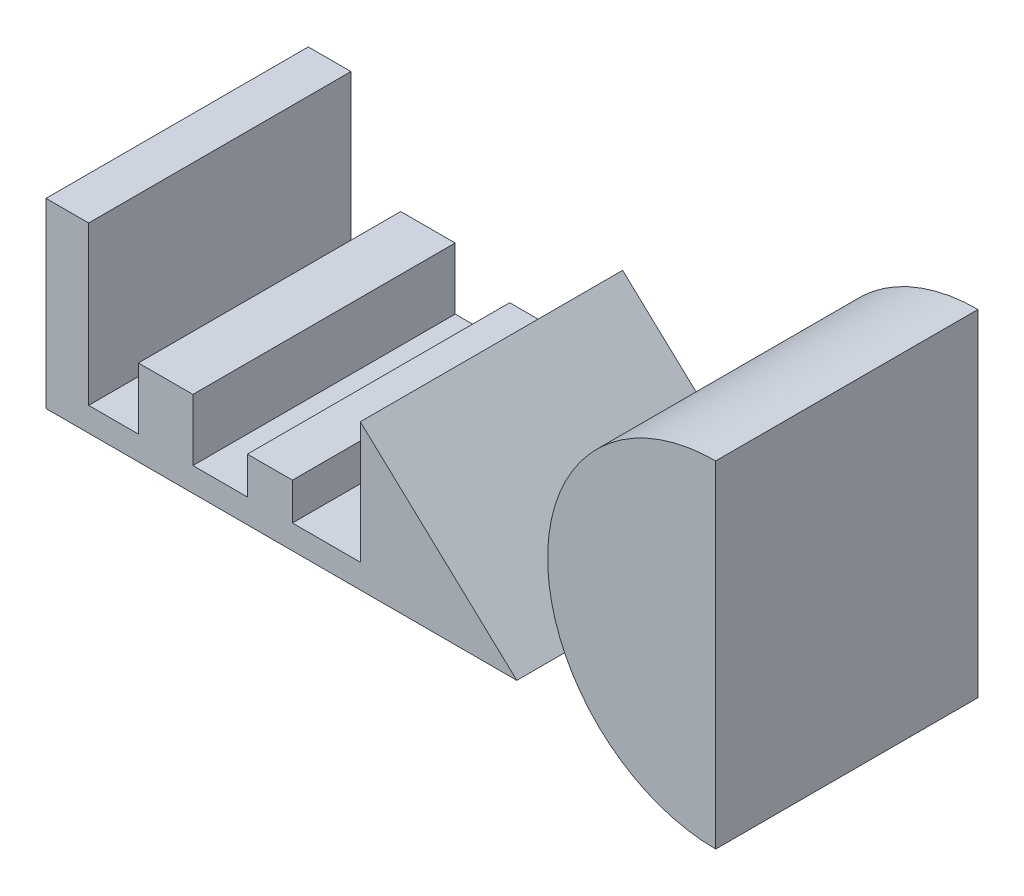
ISO-10303-21;
HEADER;
FILE_DESCRIPTION(('STEP AP214'),'2;1');
FILE_NAME('part.step','',(''),(''),'','','');
FILE_SCHEMA(('AUTOMOTIVE_DESIGN { 1 0 10303 214 1 1 1 1 }'));
ENDSEC;
DATA;
#1=APPLICATION_CONTEXT('core data for automotive mechanical design processes');
#2=APPLICATION_PROTOCOL_DEFINITION('international standard','automotive_design',2000,#1);
#3=PRODUCT_CONTEXT('',#1,'mechanical');
#4=PRODUCT('Part','Part','',(#3));
#5=PRODUCT_RELATED_PRODUCT_CATEGORY('part','',(#4));
#6=PRODUCT_DEFINITION_FORMATION('','',#4);
#7=PRODUCT_DEFINITION_CONTEXT('part definition',#1,'design');
#8=PRODUCT_DEFINITION('design','',#6,#7);
#9=PRODUCT_DEFINITION_SHAPE('','',#8);
#10=(LENGTH_UNIT() NAMED_UNIT(*) SI_UNIT(.MILLI.,.METRE.));
#11=(NAMED_UNIT(*) PLANE_ANGLE_UNIT() SI_UNIT($,.RADIAN.));
#12=(NAMED_UNIT(*) SI_UNIT($,.STERADIAN.) SOLID_ANGLE_UNIT());
#13=UNCERTAINTY_MEASURE_WITH_UNIT(LENGTH_MEASURE(1.E-05),#10,'distance_accuracy_value','');
#14=(GEOMETRIC_REPRESENTATION_CONTEXT(3) GLOBAL_UNCERTAINTY_ASSIGNED_CONTEXT((#13)) GLOBAL_UNIT_ASSIGNED_CONTEXT((#10,
#11,#12)) REPRESENTATION_CONTEXT('',''));
#15=CARTESIAN_POINT('',(0.,0.,0.));
#16=DIRECTION('',(0.,0.,1.));
#17=DIRECTION('',(1.,0.,0.));
#18=AXIS2_PLACEMENT_3D('',#15,#16,#17);
#19=CARTESIAN_POINT('',(972.879836168344,176.420111136161,190.5));
#20=DIRECTION('',(0.,0.,-1.));
#21=DIRECTION('',(-1.,0.,0.));
#22=AXIS2_PLACEMENT_3D('',#19,#20,#21);
#23=CYLINDRICAL_SURFACE('',#22,244.183019467738);
#24=CARTESIAN_POINT('',(972.879836168344,176.420111136161,-190.5));
#25=DIRECTION('',(0.,0.,1.));
#26=DIRECTION('',(1.,0.,0.));
#27=AXIS2_PLACEMENT_3D('',#24,#25,#26);
#28=CIRCLE('',#27,244.183019467738);
#29=CARTESIAN_POINT('',(972.879836168344,420.603130603899,-190.5));
#30=VERTEX_POINT('',#29);
#31=CARTESIAN_POINT('',(972.879836168344,-67.7629083315776,-190.5));
#32=VERTEX_POINT('',#31);
#33=EDGE_CURVE('E77',#30,#32,#28,.T.);
#34=ORIENTED_EDGE('',*,*,#33,.T.);
#35=DIRECTION('',(0.,0.,-1.));
#36=VECTOR('',#35,1.);
#37=CARTESIAN_POINT('',(972.879836168344,-67.7629083315776,190.5));
#38=LINE('',#37,#36);
#39=CARTESIAN_POINT('',(972.879836168344,-67.7629083315776,190.5));
#40=VERTEX_POINT('',#39);
#41=EDGE_CURVE('E12',#40,#32,#38,.T.);
#42=ORIENTED_EDGE('',*,*,#41,.F.);
#43=CARTESIAN_POINT('',(972.879836168344,176.420111136161,190.5));
#44=DIRECTION('',(0.,0.,1.));
#45=DIRECTION('',(1.,0.,0.));
#46=AXIS2_PLACEMENT_3D('',#43,#44,#45);
#47=CIRCLE('',#46,244.183019467738);
#48=CARTESIAN_POINT('',(972.879836168344,420.603130603899,190.5));
#49=VERTEX_POINT('',#48);
#50=EDGE_CURVE('E76',#49,#40,#47,.T.);
#51=ORIENTED_EDGE('',*,*,#50,.F.);
#52=DIRECTION('',(0.,0.,-1.));
#53=VECTOR('',#52,1.);
#54=CARTESIAN_POINT('',(972.879836168344,420.603130603899,190.5));
#55=LINE('',#54,#53);
#56=EDGE_CURVE('E54',#49,#30,#55,.T.);
#57=ORIENTED_EDGE('',*,*,#56,.T.);
#58=EDGE_LOOP('',(#34,#42,#51,#57));
#59=FACE_BOUND('',#58,.T.);
#60=ADVANCED_FACE('F46',(#59),#23,.T.);
#61=CARTESIAN_POINT('',(972.879836168344,420.603130603899,190.5));
#62=DIRECTION('',(-1.,0.,0.));
#63=DIRECTION('',(0.,0.,1.));
#64=AXIS2_PLACEMENT_3D('',#61,#62,#63);
#65=PLANE('',#64);
#66=DIRECTION('',(0.,1.,0.));
#67=VECTOR('',#66,1.);
#68=CARTESIAN_POINT('',(972.879836168344,420.603130603899,-190.5));
#69=LINE('',#68,#67);
#70=EDGE_CURVE('E69',#32,#30,#69,.T.);
#71=ORIENTED_EDGE('',*,*,#70,.T.);
#72=ORIENTED_EDGE('',*,*,#56,.F.);
#73=DIRECTION('',(0.,1.,0.));
#74=VECTOR('',#73,1.);
#75=CARTESIAN_POINT('',(972.879836168344,420.603130603899,190.5));
#76=LINE('',#75,#74);
#77=EDGE_CURVE('E61',#40,#49,#76,.T.);
#78=ORIENTED_EDGE('',*,*,#77,.F.);
#79=ORIENTED_EDGE('',*,*,#41,.T.);
#80=EDGE_LOOP('',(#71,#72,#78,#79));
#81=FACE_BOUND('',#80,.T.);
#82=ADVANCED_FACE('F72',(#81),#65,.F.);
#83=CARTESIAN_POINT('',(972.879836168344,176.420111136161,190.5));
#84=DIRECTION('',(0.,0.,1.));
#85=DIRECTION('',(1.,0.,0.));
#86=AXIS2_PLACEMENT_3D('',#83,#84,#85);
#87=PLANE('',#86);
#88=ORIENTED_EDGE('',*,*,#50,.T.);
#89=ORIENTED_EDGE('',*,*,#77,.T.);
#90=EDGE_LOOP('',(#88,#89));
#91=FACE_BOUND('',#90,.T.);
#92=ADVANCED_FACE('F84',(#91),#87,.T.);
#93=CARTESIAN_POINT('',(972.879836168344,176.420111136161,-190.5));
#94=DIRECTION('',(0.,0.,1.));
#95=DIRECTION('',(1.,0.,0.));
#96=AXIS2_PLACEMENT_3D('',#93,#94,#95);
#97=PLANE('',#96);
#98=ORIENTED_EDGE('',*,*,#33,.F.);
#99=ORIENTED_EDGE('',*,*,#70,.F.);
#100=EDGE_LOOP('',(#98,#99));
#101=FACE_BOUND('',#100,.T.);
#102=ADVANCED_FACE('F80',(#101),#97,.F.);
#103=CLOSED_SHELL('',(#60,#82,#92,#102));
#104=MANIFOLD_SOLID_BREP('B2',#103);
#105=CARTESIAN_POINT('',(683.937189207744,0.,190.5));
#106=DIRECTION('',(0.,1.,0.));
#107=DIRECTION('',(0.,0.,1.));
#108=AXIS2_PLACEMENT_3D('',#105,#106,#107);
#109=PLANE('',#108);
#110=DIRECTION('',(1.,0.,0.));
#111=VECTOR('',#110,1.);
#112=CARTESIAN_POINT('',(683.937189207744,0.,-190.5));
#113=LINE('',#112,#111);
#114=CARTESIAN_POINT('',(0.,0.,-190.5));
#115=VERTEX_POINT('',#114);
#116=CARTESIAN_POINT('',(683.937189207744,0.,-190.5));
#117=VERTEX_POINT('',#116);
#118=EDGE_CURVE('E255',#115,#117,#113,.T.);
#119=ORIENTED_EDGE('',*,*,#118,.T.);
#120=DIRECTION('',(0.,0.,-1.));
#121=VECTOR('',#120,1.);
#122=CARTESIAN_POINT('',(683.937189207744,0.,190.5));
#123=LINE('',#122,#121);
#124=CARTESIAN_POINT('',(683.937189207744,0.,190.5));
#125=VERTEX_POINT('',#124);
#126=EDGE_CURVE('E44',#125,#117,#123,.T.);
#127=ORIENTED_EDGE('',*,*,#126,.F.);
#128=DIRECTION('',(1.,0.,0.));
#129=VECTOR('',#128,1.);
#130=CARTESIAN_POINT('',(683.937189207744,0.,190.5));
#131=LINE('',#130,#129);
#132=CARTESIAN_POINT('',(0.,0.,190.5));
#133=VERTEX_POINT('',#132);
#134=EDGE_CURVE('E283',#133,#125,#131,.T.);
#135=ORIENTED_EDGE('',*,*,#134,.F.);
#136=DIRECTION('',(0.,0.,-1.));
#137=VECTOR('',#136,1.);
#138=CARTESIAN_POINT('',(0.,0.,190.5));
#139=LINE('',#138,#137);
#140=EDGE_CURVE('E251',#133,#115,#139,.T.);
#141=ORIENTED_EDGE('',*,*,#140,.T.);
#142=EDGE_LOOP('',(#119,#127,#135,#141));
#143=FACE_BOUND('',#142,.T.);
#144=ADVANCED_FACE('F117',(#143),#109,.F.);
#145=CARTESIAN_POINT('',(456.600579214778,211.665343882228,190.5));
#146=DIRECTION('',(-0.681430807762917,-0.731882541280756,0.));
#147=DIRECTION('',(0.731882541280756,-0.681430807762917,0.));
#148=AXIS2_PLACEMENT_3D('',#145,#146,#147);
#149=PLANE('',#148);
#150=DIRECTION('',(-0.731882541280756,0.681430807762917,0.));
#151=VECTOR('',#150,1.);
#152=CARTESIAN_POINT('',(456.600579214778,211.665343882228,-190.5));
#153=LINE('',#152,#151);
#154=CARTESIAN_POINT('',(456.600579214778,211.665343882228,-190.5));
#155=VERTEX_POINT('',#154);
#156=EDGE_CURVE('E258',#117,#155,#153,.T.);
#157=ORIENTED_EDGE('',*,*,#156,.T.);
#158=DIRECTION('',(0.,0.,-1.));
#159=VECTOR('',#158,1.);
#160=CARTESIAN_POINT('',(456.600579214778,211.665343882228,190.5));
#161=LINE('',#160,#159);
#162=CARTESIAN_POINT('',(456.600579214778,211.665343882228,190.5));
#163=VERTEX_POINT('',#162);
#164=EDGE_CURVE('E125',#163,#155,#161,.T.);
#165=ORIENTED_EDGE('',*,*,#164,.F.);
#166=DIRECTION('',(-0.731882541280756,0.681430807762917,0.));
#167=VECTOR('',#166,1.);
#168=CARTESIAN_POINT('',(456.600579214778,211.665343882228,190.5));
#169=LINE('',#168,#167);
#170=EDGE_CURVE('E197',#125,#163,#169,.T.);
#171=ORIENTED_EDGE('',*,*,#170,.F.);
#172=ORIENTED_EDGE('',*,*,#126,.T.);
#173=EDGE_LOOP('',(#157,#165,#171,#172));
#174=FACE_BOUND('',#173,.T.);
#175=ADVANCED_FACE('F376',(#174),#149,.F.);
#176=CARTESIAN_POINT('',(456.600579214778,34.9907479046501,190.5));
#177=DIRECTION('',(1.,0.,0.));
#178=DIRECTION('',(0.,0.,-1.));
#179=AXIS2_PLACEMENT_3D('',#176,#177,#178);
#180=PLANE('',#179);
#181=DIRECTION('',(0.,-1.,0.));
#182=VECTOR('',#181,1.);
#183=CARTESIAN_POINT('',(456.600579214778,34.9907479046501,-190.5));
#184=LINE('',#183,#182);
#185=CARTESIAN_POINT('',(456.600579214778,34.9907479046501,-190.5));
#186=VERTEX_POINT('',#185);
#187=EDGE_CURVE('E260',#155,#186,#184,.T.);
#188=ORIENTED_EDGE('',*,*,#187,.T.);
#189=DIRECTION('',(0.,0.,-1.));
#190=VECTOR('',#189,1.);
#191=CARTESIAN_POINT('',(456.600579214778,34.9907479046501,190.5));
#192=LINE('',#191,#190);
#193=CARTESIAN_POINT('',(456.600579214778,34.9907479046501,190.5));
#194=VERTEX_POINT('',#193);
#195=EDGE_CURVE('E311',#194,#186,#192,.T.);
#196=ORIENTED_EDGE('',*,*,#195,.F.);
#197=DIRECTION('',(0.,-1.,0.));
#198=VECTOR('',#197,1.);
#199=CARTESIAN_POINT('',(456.600579214778,34.9907479046501,190.5));
#200=LINE('',#199,#198);
#201=EDGE_CURVE('E319',#163,#194,#200,.T.);
#202=ORIENTED_EDGE('',*,*,#201,.F.);
#203=ORIENTED_EDGE('',*,*,#164,.T.);
#204=EDGE_LOOP('',(#188,#196,#202,#203));
#205=FACE_BOUND('',#204,.T.);
#206=ADVANCED_FACE('F317',(#205),#180,.F.);
#207=CARTESIAN_POINT('',(357.938142500027,34.9907479046501,190.5));
#208=DIRECTION('',(0.,-1.,0.));
#209=DIRECTION('',(0.,0.,-1.));
#210=AXIS2_PLACEMENT_3D('',#207,#208,#209);
#211=PLANE('',#210);
#212=DIRECTION('',(-1.,0.,0.));
#213=VECTOR('',#212,1.);
#214=CARTESIAN_POINT('',(357.938142500027,34.9907479046501,-190.5));
#215=LINE('',#214,#213);
#216=CARTESIAN_POINT('',(357.938142500027,34.9907479046501,-190.5));
#217=VERTEX_POINT('',#216);
#218=EDGE_CURVE('E262',#186,#217,#215,.T.);
#219=ORIENTED_EDGE('',*,*,#218,.T.);
#220=DIRECTION('',(0.,0.,-1.));
#221=VECTOR('',#220,1.);
#222=CARTESIAN_POINT('',(357.938142500027,34.9907479046501,190.5));
#223=LINE('',#222,#221);
#224=CARTESIAN_POINT('',(357.938142500027,34.9907479046501,190.5));
#225=VERTEX_POINT('',#224);
#226=EDGE_CURVE('E308',#225,#217,#223,.T.);
#227=ORIENTED_EDGE('',*,*,#226,.F.);
#228=DIRECTION('',(-1.,0.,0.));
#229=VECTOR('',#228,1.);
#230=CARTESIAN_POINT('',(357.938142500027,34.9907479046501,190.5));
#231=LINE('',#230,#229);
#232=EDGE_CURVE('E337',#194,#225,#231,.T.);
#233=ORIENTED_EDGE('',*,*,#232,.F.);
#234=ORIENTED_EDGE('',*,*,#195,.T.);
#235=EDGE_LOOP('',(#219,#227,#233,#234));
#236=FACE_BOUND('',#235,.T.);
#237=ADVANCED_FACE('F328',(#236),#211,.F.);
#238=CARTESIAN_POINT('',(357.938142500027,88.9109168068977,190.5));
#239=DIRECTION('',(-1.,0.,0.));
#240=DIRECTION('',(0.,0.,1.));
#241=AXIS2_PLACEMENT_3D('',#238,#239,#240);
#242=PLANE('',#241);
#243=DIRECTION('',(0.,1.,0.));
#244=VECTOR('',#243,1.);
#245=CARTESIAN_POINT('',(357.938142500027,88.9109168068977,-190.5));
#246=LINE('',#245,#244);
#247=CARTESIAN_POINT('',(357.938142500027,88.9109168068977,-190.5));
#248=VERTEX_POINT('',#247);
#249=EDGE_CURVE('E264',#217,#248,#246,.T.);
#250=ORIENTED_EDGE('',*,*,#249,.T.);
#251=DIRECTION('',(0.,0.,-1.));
#252=VECTOR('',#251,1.);
#253=CARTESIAN_POINT('',(357.938142500027,88.9109168068977,190.5));
#254=LINE('',#253,#252);
#255=CARTESIAN_POINT('',(357.938142500027,88.9109168068977,190.5));
#256=VERTEX_POINT('',#255);
#257=EDGE_CURVE('E305',#256,#248,#254,.T.);
#258=ORIENTED_EDGE('',*,*,#257,.F.);
#259=DIRECTION('',(0.,1.,0.));
#260=VECTOR('',#259,1.);
#261=CARTESIAN_POINT('',(357.938142500027,88.9109168068977,190.5));
#262=LINE('',#261,#260);
#263=EDGE_CURVE('E334',#225,#256,#262,.T.);
#264=ORIENTED_EDGE('',*,*,#263,.F.);
#265=ORIENTED_EDGE('',*,*,#226,.T.);
#266=EDGE_LOOP('',(#250,#258,#264,#265));
#267=FACE_BOUND('',#266,.T.);
#268=ADVANCED_FACE('F332',(#267),#242,.F.);
#269=CARTESIAN_POINT('',(292.545597235599,88.9109168068977,190.5));
#270=DIRECTION('',(0.,-1.,0.));
#271=DIRECTION('',(0.,0.,-1.));
#272=AXIS2_PLACEMENT_3D('',#269,#270,#271);
#273=PLANE('',#272);
#274=DIRECTION('',(-1.,0.,0.));
#275=VECTOR('',#274,1.);
#276=CARTESIAN_POINT('',(292.545597235599,88.9109168068977,-190.5));
#277=LINE('',#276,#275);
#278=CARTESIAN_POINT('',(292.545597235599,88.9109168068977,-190.5));
#279=VERTEX_POINT('',#278);
#280=EDGE_CURVE('E266',#248,#279,#277,.T.);
#281=ORIENTED_EDGE('',*,*,#280,.T.);
#282=DIRECTION('',(0.,0.,-1.));
#283=VECTOR('',#282,1.);
#284=CARTESIAN_POINT('',(292.545597235599,88.9109168068977,190.5));
#285=LINE('',#284,#283);
#286=CARTESIAN_POINT('',(292.545597235599,88.9109168068977,190.5));
#287=VERTEX_POINT('',#286);
#288=EDGE_CURVE('E302',#287,#279,#285,.T.);
#289=ORIENTED_EDGE('',*,*,#288,.F.);
#290=DIRECTION('',(-1.,0.,0.));
#291=VECTOR('',#290,1.);
#292=CARTESIAN_POINT('',(292.545597235599,88.9109168068977,190.5));
#293=LINE('',#292,#291);
#294=EDGE_CURVE('E336',#256,#287,#293,.T.);
#295=ORIENTED_EDGE('',*,*,#294,.F.);
#296=ORIENTED_EDGE('',*,*,#257,.T.);
#297=EDGE_LOOP('',(#281,#289,#295,#296));
#298=FACE_BOUND('',#297,.T.);
#299=ADVANCED_FACE('F389',(#298),#273,.F.);
#300=CARTESIAN_POINT('',(292.545597235599,34.9907479046501,190.5));
#301=DIRECTION('',(1.,0.,0.));
#302=DIRECTION('',(0.,0.,-1.));
#303=AXIS2_PLACEMENT_3D('',#300,#301,#302);
#304=PLANE('',#303);
#305=DIRECTION('',(0.,-1.,0.));
#306=VECTOR('',#305,1.);
#307=CARTESIAN_POINT('',(292.545597235599,34.9907479046501,-190.5));
#308=LINE('',#307,#306);
#309=CARTESIAN_POINT('',(292.545597235599,34.9907479046501,-190.5));
#310=VERTEX_POINT('',#309);
#311=EDGE_CURVE('E268',#279,#310,#308,.T.);
#312=ORIENTED_EDGE('',*,*,#311,.T.);
#313=DIRECTION('',(0.,0.,-1.));
#314=VECTOR('',#313,1.);
#315=CARTESIAN_POINT('',(292.545597235599,34.9907479046501,190.5));
#316=LINE('',#315,#314);
#317=CARTESIAN_POINT('',(292.545597235599,34.9907479046501,190.5));
#318=VERTEX_POINT('',#317);
#319=EDGE_CURVE('E299',#318,#310,#316,.T.);
#320=ORIENTED_EDGE('',*,*,#319,.F.);
#321=DIRECTION('',(0.,-1.,0.));
#322=VECTOR('',#321,1.);
#323=CARTESIAN_POINT('',(292.545597235599,34.9907479046501,190.5));
#324=LINE('',#323,#322);
#325=EDGE_CURVE('E339',#287,#318,#324,.T.);
#326=ORIENTED_EDGE('',*,*,#325,.F.);
#327=ORIENTED_EDGE('',*,*,#288,.T.);
#328=EDGE_LOOP('',(#312,#320,#326,#327));
#329=FACE_BOUND('',#328,.T.);
#330=ADVANCED_FACE('F392',(#329),#304,.F.);
#331=CARTESIAN_POINT('',(213.386200336555,34.9907479046501,190.5));
#332=DIRECTION('',(0.,-1.,0.));
#333=DIRECTION('',(0.,0.,-1.));
#334=AXIS2_PLACEMENT_3D('',#331,#332,#333);
#335=PLANE('',#334);
#336=DIRECTION('',(-1.,0.,0.));
#337=VECTOR('',#336,1.);
#338=CARTESIAN_POINT('',(213.386200336555,34.9907479046501,-190.5));
#339=LINE('',#338,#337);
#340=CARTESIAN_POINT('',(213.386200336555,34.9907479046501,-190.5));
#341=VERTEX_POINT('',#340);
#342=EDGE_CURVE('E270',#310,#341,#339,.T.);
#343=ORIENTED_EDGE('',*,*,#342,.T.);
#344=DIRECTION('',(0.,0.,-1.));
#345=VECTOR('',#344,1.);
#346=CARTESIAN_POINT('',(213.386200336555,34.9907479046501,190.5));
#347=LINE('',#346,#345);
#348=CARTESIAN_POINT('',(213.386200336555,34.9907479046501,190.5));
#349=VERTEX_POINT('',#348);
#350=EDGE_CURVE('E296',#349,#341,#347,.T.);
#351=ORIENTED_EDGE('',*,*,#350,.F.);
#352=DIRECTION('',(-1.,0.,0.));
#353=VECTOR('',#352,1.);
#354=CARTESIAN_POINT('',(213.386200336555,34.9907479046501,190.5));
#355=LINE('',#354,#353);
#356=EDGE_CURVE('E345',#318,#349,#355,.T.);
#357=ORIENTED_EDGE('',*,*,#356,.F.);
#358=ORIENTED_EDGE('',*,*,#319,.T.);
#359=EDGE_LOOP('',(#343,#351,#357,#358));
#360=FACE_BOUND('',#359,.T.);
#361=ADVANCED_FACE('F396',(#360),#335,.F.);
#362=CARTESIAN_POINT('',(213.386200336555,124.475283529657,190.5));
#363=DIRECTION('',(-1.,0.,0.));
#364=DIRECTION('',(0.,0.,1.));
#365=AXIS2_PLACEMENT_3D('',#362,#363,#364);
#366=PLANE('',#365);
#367=DIRECTION('',(0.,1.,0.));
#368=VECTOR('',#367,1.);
#369=CARTESIAN_POINT('',(213.386200336555,124.475283529657,-190.5));
#370=LINE('',#369,#368);
#371=CARTESIAN_POINT('',(213.386200336555,124.475283529657,-190.5));
#372=VERTEX_POINT('',#371);
#373=EDGE_CURVE('E272',#341,#372,#370,.T.);
#374=ORIENTED_EDGE('',*,*,#373,.T.);
#375=DIRECTION('',(0.,0.,-1.));
#376=VECTOR('',#375,1.);
#377=CARTESIAN_POINT('',(213.386200336555,124.475283529657,190.5));
#378=LINE('',#377,#376);
#379=CARTESIAN_POINT('',(213.386200336555,124.475283529657,190.5));
#380=VERTEX_POINT('',#379);
#381=EDGE_CURVE('E293',#380,#372,#378,.T.);
#382=ORIENTED_EDGE('',*,*,#381,.F.);
#383=DIRECTION('',(0.,1.,0.));
#384=VECTOR('',#383,1.);
#385=CARTESIAN_POINT('',(213.386200336555,124.475283529657,190.5));
#386=LINE('',#385,#384);
#387=EDGE_CURVE('E347',#349,#380,#386,.T.);
#388=ORIENTED_EDGE('',*,*,#387,.F.);
#389=ORIENTED_EDGE('',*,*,#350,.T.);
#390=EDGE_LOOP('',(#374,#382,#388,#389));
#391=FACE_BOUND('',#390,.T.);
#392=ADVANCED_FACE('F400',(#391),#366,.F.);
#393=CARTESIAN_POINT('',(134.22680343751,124.475283529657,190.5));
#394=DIRECTION('',(0.,-1.,0.));
#395=DIRECTION('',(0.,0.,-1.));
#396=AXIS2_PLACEMENT_3D('',#393,#394,#395);
#397=PLANE('',#396);
#398=DIRECTION('',(-1.,0.,0.));
#399=VECTOR('',#398,1.);
#400=CARTESIAN_POINT('',(134.22680343751,124.475283529657,-190.5));
#401=LINE('',#400,#399);
#402=CARTESIAN_POINT('',(134.22680343751,124.475283529657,-190.5));
#403=VERTEX_POINT('',#402);
#404=EDGE_CURVE('E274',#372,#403,#401,.T.);
#405=ORIENTED_EDGE('',*,*,#404,.T.);
#406=DIRECTION('',(0.,0.,-1.));
#407=VECTOR('',#406,1.);
#408=CARTESIAN_POINT('',(134.22680343751,124.475283529657,190.5));
#409=LINE('',#408,#407);
#410=CARTESIAN_POINT('',(134.22680343751,124.475283529657,190.5));
#411=VERTEX_POINT('',#410);
#412=EDGE_CURVE('E290',#411,#403,#409,.T.);
#413=ORIENTED_EDGE('',*,*,#412,.F.);
#414=DIRECTION('',(-1.,0.,0.));
#415=VECTOR('',#414,1.);
#416=CARTESIAN_POINT('',(134.22680343751,124.475283529657,190.5));
#417=LINE('',#416,#415);
#418=EDGE_CURVE('E349',#380,#411,#417,.T.);
#419=ORIENTED_EDGE('',*,*,#418,.F.);
#420=ORIENTED_EDGE('',*,*,#381,.T.);
#421=EDGE_LOOP('',(#405,#413,#419,#420));
#422=FACE_BOUND('',#421,.T.);
#423=ADVANCED_FACE('F404',(#422),#397,.F.);
#424=CARTESIAN_POINT('',(134.22680343751,34.9907479046501,190.5));
#425=DIRECTION('',(1.,0.,0.));
#426=DIRECTION('',(0.,0.,-1.));
#427=AXIS2_PLACEMENT_3D('',#424,#425,#426);
#428=PLANE('',#427);
#429=DIRECTION('',(0.,-1.,0.));
#430=VECTOR('',#429,1.);
#431=CARTESIAN_POINT('',(134.22680343751,34.9907479046501,-190.5));
#432=LINE('',#431,#430);
#433=CARTESIAN_POINT('',(134.22680343751,34.9907479046501,-190.5));
#434=VERTEX_POINT('',#433);
#435=EDGE_CURVE('E276',#403,#434,#432,.T.);
#436=ORIENTED_EDGE('',*,*,#435,.T.);
#437=DIRECTION('',(0.,0.,-1.));
#438=VECTOR('',#437,1.);
#439=CARTESIAN_POINT('',(134.22680343751,34.9907479046501,190.5));
#440=LINE('',#439,#438);
#441=CARTESIAN_POINT('',(134.22680343751,34.9907479046501,190.5));
#442=VERTEX_POINT('',#441);
#443=EDGE_CURVE('E287',#442,#434,#440,.T.);
#444=ORIENTED_EDGE('',*,*,#443,.F.);
#445=DIRECTION('',(0.,-1.,0.));
#446=VECTOR('',#445,1.);
#447=CARTESIAN_POINT('',(134.22680343751,34.9907479046501,190.5));
#448=LINE('',#447,#446);
#449=EDGE_CURVE('E351',#411,#442,#448,.T.);
#450=ORIENTED_EDGE('',*,*,#449,.F.);
#451=ORIENTED_EDGE('',*,*,#412,.T.);
#452=EDGE_LOOP('',(#436,#444,#450,#451));
#453=FACE_BOUND('',#452,.T.);
#454=ADVANCED_FACE('F357',(#453),#428,.F.);
#455=CARTESIAN_POINT('',(61.9508323557739,34.9907479046501,190.5));
#456=DIRECTION('',(0.,-1.,0.));
#457=DIRECTION('',(0.,0.,-1.));
#458=AXIS2_PLACEMENT_3D('',#455,#456,#457);
#459=PLANE('',#458);
#460=DIRECTION('',(-1.,0.,0.));
#461=VECTOR('',#460,1.);
#462=CARTESIAN_POINT('',(61.9508323557739,34.9907479046501,-190.5));
#463=LINE('',#462,#461);
#464=CARTESIAN_POINT('',(61.9508323557739,34.9907479046501,-190.5));
#465=VERTEX_POINT('',#464);
#466=EDGE_CURVE('E278',#434,#465,#463,.T.);
#467=ORIENTED_EDGE('',*,*,#466,.T.);
#468=DIRECTION('',(0.,0.,-1.));
#469=VECTOR('',#468,1.);
#470=CARTESIAN_POINT('',(61.9508323557739,34.9907479046501,190.5));
#471=LINE('',#470,#469);
#472=CARTESIAN_POINT('',(61.9508323557739,34.9907479046501,190.5));
#473=VERTEX_POINT('',#472);
#474=EDGE_CURVE('E246',#473,#465,#471,.T.);
#475=ORIENTED_EDGE('',*,*,#474,.F.);
#476=DIRECTION('',(-1.,0.,0.));
#477=VECTOR('',#476,1.);
#478=CARTESIAN_POINT('',(61.9508323557739,34.9907479046501,190.5));
#479=LINE('',#478,#477);
#480=EDGE_CURVE('E237',#442,#473,#479,.T.);
#481=ORIENTED_EDGE('',*,*,#480,.F.);
#482=ORIENTED_EDGE('',*,*,#443,.T.);
#483=EDGE_LOOP('',(#467,#475,#481,#482));
#484=FACE_BOUND('',#483,.T.);
#485=ADVANCED_FACE('F361',(#484),#459,.F.);
#486=CARTESIAN_POINT('',(61.9508323557739,264.438275148257,190.5));
#487=DIRECTION('',(-1.,0.,0.));
#488=DIRECTION('',(0.,0.,1.));
#489=AXIS2_PLACEMENT_3D('',#486,#487,#488);
#490=PLANE('',#489);
#491=DIRECTION('',(0.,1.,0.));
#492=VECTOR('',#491,1.);
#493=CARTESIAN_POINT('',(61.9508323557739,264.438275148257,-190.5));
#494=LINE('',#493,#492);
#495=CARTESIAN_POINT('',(61.9508323557739,264.438275148257,-190.5));
#496=VERTEX_POINT('',#495);
#497=EDGE_CURVE('E245',#465,#496,#494,.T.);
#498=ORIENTED_EDGE('',*,*,#497,.T.);
#499=DIRECTION('',(0.,0.,-1.));
#500=VECTOR('',#499,1.);
#501=CARTESIAN_POINT('',(61.9508323557739,264.438275148257,190.5));
#502=LINE('',#501,#500);
#503=CARTESIAN_POINT('',(61.9508323557739,264.438275148257,190.5));
#504=VERTEX_POINT('',#503);
#505=EDGE_CURVE('E242',#504,#496,#502,.T.);
#506=ORIENTED_EDGE('',*,*,#505,.F.);
#507=DIRECTION('',(0.,1.,0.));
#508=VECTOR('',#507,1.);
#509=CARTESIAN_POINT('',(61.9508323557739,264.438275148257,190.5));
#510=LINE('',#509,#508);
#511=EDGE_CURVE('E231',#473,#504,#510,.T.);
#512=ORIENTED_EDGE('',*,*,#511,.F.);
#513=ORIENTED_EDGE('',*,*,#474,.T.);
#514=EDGE_LOOP('',(#498,#506,#512,#513));
#515=FACE_BOUND('',#514,.T.);
#516=ADVANCED_FACE('F243',(#515),#490,.F.);
#517=CARTESIAN_POINT('',(0.,264.438275148257,190.5));
#518=DIRECTION('',(0.,-1.,0.));
#519=DIRECTION('',(0.,0.,-1.));
#520=AXIS2_PLACEMENT_3D('',#517,#518,#519);
#521=PLANE('',#520);
#522=DIRECTION('',(-1.,0.,0.));
#523=VECTOR('',#522,1.);
#524=CARTESIAN_POINT('',(0.,264.438275148257,-190.5));
#525=LINE('',#524,#523);
#526=CARTESIAN_POINT('',(0.,264.438275148257,-190.5));
#527=VERTEX_POINT('',#526);
#528=EDGE_CURVE('E183',#496,#527,#525,.T.);
#529=ORIENTED_EDGE('',*,*,#528,.T.);
#530=DIRECTION('',(0.,0.,-1.));
#531=VECTOR('',#530,1.);
#532=CARTESIAN_POINT('',(0.,264.438275148257,190.5));
#533=LINE('',#532,#531);
#534=CARTESIAN_POINT('',(0.,264.438275148257,190.5));
#535=VERTEX_POINT('',#534);
#536=EDGE_CURVE('E247',#535,#527,#533,.T.);
#537=ORIENTED_EDGE('',*,*,#536,.F.);
#538=DIRECTION('',(-1.,0.,0.));
#539=VECTOR('',#538,1.);
#540=CARTESIAN_POINT('',(0.,264.438275148257,190.5));
#541=LINE('',#540,#539);
#542=EDGE_CURVE('E235',#504,#535,#541,.T.);
#543=ORIENTED_EDGE('',*,*,#542,.F.);
#544=ORIENTED_EDGE('',*,*,#505,.T.);
#545=EDGE_LOOP('',(#529,#537,#543,#544));
#546=FACE_BOUND('',#545,.T.);
#547=ADVANCED_FACE('F249',(#546),#521,.F.);
#548=CARTESIAN_POINT('',(0.,0.,190.5));
#549=DIRECTION('',(1.,0.,0.));
#550=DIRECTION('',(0.,0.,-1.));
#551=AXIS2_PLACEMENT_3D('',#548,#549,#550);
#552=PLANE('',#551);
#553=DIRECTION('',(0.,-1.,0.));
#554=VECTOR('',#553,1.);
#555=CARTESIAN_POINT('',(0.,0.,-190.5));
#556=LINE('',#555,#554);
#557=EDGE_CURVE('E189',#527,#115,#556,.T.);
#558=ORIENTED_EDGE('',*,*,#557,.T.);
#559=ORIENTED_EDGE('',*,*,#140,.F.);
#560=DIRECTION('',(0.,-1.,0.));
#561=VECTOR('',#560,1.);
#562=CARTESIAN_POINT('',(0.,0.,190.5));
#563=LINE('',#562,#561);
#564=EDGE_CURVE('E133',#535,#133,#563,.T.);
#565=ORIENTED_EDGE('',*,*,#564,.F.);
#566=ORIENTED_EDGE('',*,*,#536,.T.);
#567=EDGE_LOOP('',(#558,#559,#565,#566));
#568=FACE_BOUND('',#567,.T.);
#569=ADVANCED_FACE('F365',(#568),#552,.F.);
#570=CARTESIAN_POINT('',(0.,0.,190.5));
#571=DIRECTION('',(0.,0.,-1.));
#572=DIRECTION('',(-1.,0.,0.));
#573=AXIS2_PLACEMENT_3D('',#570,#571,#572);
#574=PLANE('',#573);
#575=ORIENTED_EDGE('',*,*,#134,.T.);
#576=ORIENTED_EDGE('',*,*,#170,.T.);
#577=ORIENTED_EDGE('',*,*,#201,.T.);
#578=ORIENTED_EDGE('',*,*,#232,.T.);
#579=ORIENTED_EDGE('',*,*,#263,.T.);
#580=ORIENTED_EDGE('',*,*,#294,.T.);
#581=ORIENTED_EDGE('',*,*,#325,.T.);
#582=ORIENTED_EDGE('',*,*,#356,.T.);
#583=ORIENTED_EDGE('',*,*,#387,.T.);
#584=ORIENTED_EDGE('',*,*,#418,.T.);
#585=ORIENTED_EDGE('',*,*,#449,.T.);
#586=ORIENTED_EDGE('',*,*,#480,.T.);
#587=ORIENTED_EDGE('',*,*,#511,.T.);
#588=ORIENTED_EDGE('',*,*,#542,.T.);
#589=ORIENTED_EDGE('',*,*,#564,.T.);
#590=EDGE_LOOP('',(#575,#576,#577,#578,#579,#580,#581,#582,#583,#584,#585,#586,#587,#588,#589));
#591=FACE_BOUND('',#590,.T.);
#592=ADVANCED_FACE('F233',(#591),#574,.F.);
#593=CARTESIAN_POINT('',(0.,0.,-190.5));
#594=DIRECTION('',(0.,0.,-1.));
#595=DIRECTION('',(-1.,0.,0.));
#596=AXIS2_PLACEMENT_3D('',#593,#594,#595);
#597=PLANE('',#596);
#598=ORIENTED_EDGE('',*,*,#118,.F.);
#599=ORIENTED_EDGE('',*,*,#557,.F.);
#600=ORIENTED_EDGE('',*,*,#528,.F.);
#601=ORIENTED_EDGE('',*,*,#497,.F.);
#602=ORIENTED_EDGE('',*,*,#466,.F.);
#603=ORIENTED_EDGE('',*,*,#435,.F.);
#604=ORIENTED_EDGE('',*,*,#404,.F.);
#605=ORIENTED_EDGE('',*,*,#373,.F.);
#606=ORIENTED_EDGE('',*,*,#342,.F.);
#607=ORIENTED_EDGE('',*,*,#311,.F.);
#608=ORIENTED_EDGE('',*,*,#280,.F.);
#609=ORIENTED_EDGE('',*,*,#249,.F.);
#610=ORIENTED_EDGE('',*,*,#218,.F.);
#611=ORIENTED_EDGE('',*,*,#187,.F.);
#612=ORIENTED_EDGE('',*,*,#156,.F.);
#613=EDGE_LOOP('',(#598,#599,#600,#601,#602,#603,#604,#605,#606,#607,#608,#609,#610,#611,#612));
#614=FACE_BOUND('',#613,.T.);
#615=ADVANCED_FACE('F323',(#614),#597,.T.);
#616=CLOSED_SHELL('',(#144,#175,#206,#237,#268,#299,#330,#361,#392,#423,#454,#485,#516,#547,
#569,#592,#615));
#617=MANIFOLD_SOLID_BREP('B6',#616);
#618=ADVANCED_BREP_SHAPE_REPRESENTATION('',(#18,#104,#617),#14);
#619=SHAPE_DEFINITION_REPRESENTATION(#9,#618);
ENDSEC;
END-ISO-10303-21;
